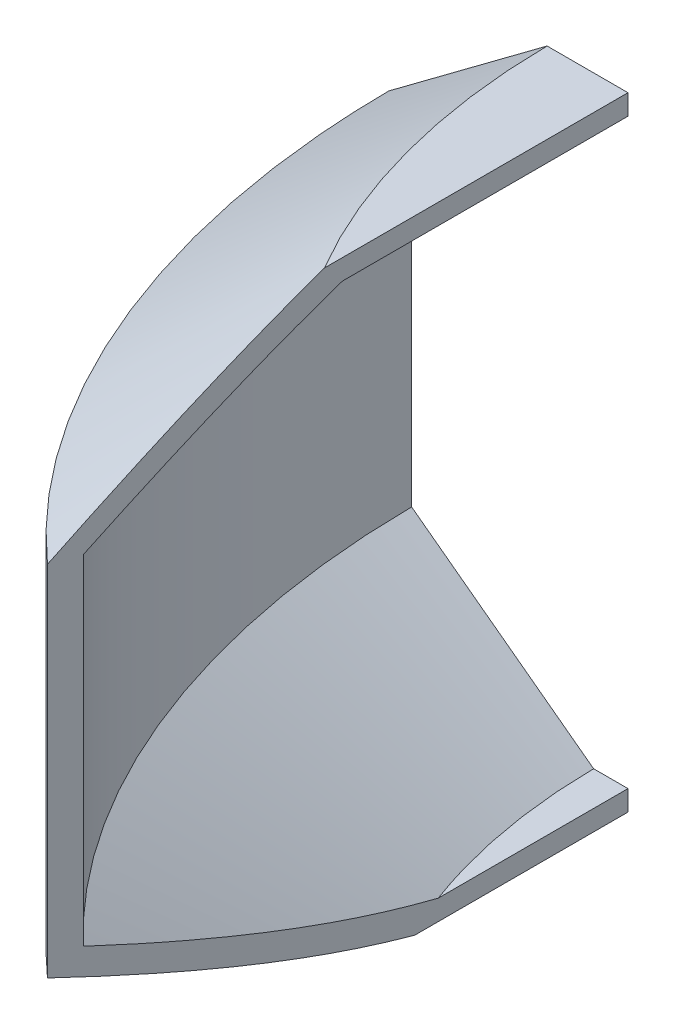
ISO-10303-21;
HEADER;
FILE_DESCRIPTION(('STEP AP214'),'2;1');
FILE_NAME('part.step','',(''),(''),'','','');
FILE_SCHEMA(('AUTOMOTIVE_DESIGN { 1 0 10303 214 1 1 1 1 }'));
ENDSEC;
DATA;
#1=APPLICATION_CONTEXT('core data for automotive mechanical design processes');
#2=APPLICATION_PROTOCOL_DEFINITION('international standard','automotive_design',2000,#1);
#3=PRODUCT_CONTEXT('',#1,'mechanical');
#4=PRODUCT('Part','Part','',(#3));
#5=PRODUCT_RELATED_PRODUCT_CATEGORY('part','',(#4));
#6=PRODUCT_DEFINITION_FORMATION('','',#4);
#7=PRODUCT_DEFINITION_CONTEXT('part definition',#1,'design');
#8=PRODUCT_DEFINITION('design','',#6,#7);
#9=PRODUCT_DEFINITION_SHAPE('','',#8);
#10=(LENGTH_UNIT() NAMED_UNIT(*) SI_UNIT(.MILLI.,.METRE.));
#11=(NAMED_UNIT(*) PLANE_ANGLE_UNIT() SI_UNIT($,.RADIAN.));
#12=(NAMED_UNIT(*) SI_UNIT($,.STERADIAN.) SOLID_ANGLE_UNIT());
#13=UNCERTAINTY_MEASURE_WITH_UNIT(LENGTH_MEASURE(1.E-05),#10,'distance_accuracy_value','');
#14=(GEOMETRIC_REPRESENTATION_CONTEXT(3) GLOBAL_UNCERTAINTY_ASSIGNED_CONTEXT((#13)) GLOBAL_UNIT_ASSIGNED_CONTEXT((#10,
#11,#12)) REPRESENTATION_CONTEXT('',''));
#15=CARTESIAN_POINT('',(0.,0.,0.));
#16=DIRECTION('',(0.,0.,1.));
#17=DIRECTION('',(1.,0.,0.));
#18=AXIS2_PLACEMENT_3D('',#15,#16,#17);
#19=CARTESIAN_POINT('',(0.,0.,150.));
#20=DIRECTION('',(0.,0.,1.));
#21=DIRECTION('',(1.,0.,0.));
#22=AXIS2_PLACEMENT_3D('',#19,#20,#21);
#23=PLANE('',#22);
#24=CARTESIAN_POINT('',(-325.505149333651,65.1189106132931,150.));
#25=CARTESIAN_POINT('',(-324.092485212729,66.1725488228257,150.));
#26=CARTESIAN_POINT('',(-322.67982050428,67.226186244635,150.));
#27=CARTESIAN_POINT('',(-319.854489464162,69.3334589119173,150.));
#28=CARTESIAN_POINT('',(-318.441823132493,70.3870941573903,150.));
#29=CARTESIAN_POINT('',(-314.203821030365,73.5479957280012,150.));
#30=CARTESIAN_POINT('',(-311.378482152828,75.6552578872993,150.));
#31=CARTESIAN_POINT('',(-308.553137339858,77.7625120885841,150.));
#32=B_SPLINE_CURVE_WITH_KNOTS('',3,(#24,#25,#26,#27,#28,#29,#30,#31),.UNSPECIFIED.,.F.,.F.,(4,2,
2,4),(0.,5.28696137267602,10.5739227453527,21.1478454908659),.UNSPECIFIED.);
#33=CARTESIAN_POINT('',(-325.505149333651,65.118910613293,150.));
#34=VERTEX_POINT('',#33);
#35=CARTESIAN_POINT('',(-308.553137339858,77.7625120885842,150.));
#36=VERTEX_POINT('',#35);
#37=EDGE_CURVE('E272',#34,#36,#32,.T.);
#38=ORIENTED_EDGE('',*,*,#37,.F.);
#39=DIRECTION('',(0.,1.,0.));
#40=VECTOR('',#39,1.);
#41=CARTESIAN_POINT('',(-325.505149333651,45.1189106132931,150.));
#42=LINE('',#41,#40);
#43=CARTESIAN_POINT('',(-325.505149333651,25.118910613293,150.));
#44=VERTEX_POINT('',#43);
#45=EDGE_CURVE('E224',#44,#34,#42,.T.);
#46=ORIENTED_EDGE('',*,*,#45,.F.);
#47=CARTESIAN_POINT('',(-304.052957277802,9.11891061329304,150.));
#48=CARTESIAN_POINT('',(-307.628340813314,11.7855528874402,150.));
#49=CARTESIAN_POINT('',(-311.20371239795,14.4522111849503,150.));
#50=CARTESIAN_POINT('',(-316.566758271069,18.4522140552676,150.));
#51=CARTESIAN_POINT('',(-318.354438311504,19.7855509160752,150.));
#52=CARTESIAN_POINT('',(-321.929795628149,22.4522283438555,150.));
#53=CARTESIAN_POINT('',(-323.717472904358,23.7855689108282,150.));
#54=CARTESIAN_POINT('',(-325.505149333651,25.1189106132931,150.));
#55=B_SPLINE_CURVE_WITH_KNOTS('',3,(#47,#48,#49,#50,#51,#52,#53,#54),.UNSPECIFIED.,.F.,.F.,(4,2,
2,4),(0.,13.3809243325822,20.0713864991394,26.7618486657284),.UNSPECIFIED.);
#56=CARTESIAN_POINT('',(-304.052957277802,9.11891061329304,150.));
#57=VERTEX_POINT('',#56);
#58=EDGE_CURVE('E218',#57,#44,#55,.T.);
#59=ORIENTED_EDGE('',*,*,#58,.F.);
#60=DIRECTION('',(-1.,0.,0.));
#61=VECTOR('',#60,1.);
#62=CARTESIAN_POINT('',(-304.054799780113,9.11891061329304,150.));
#63=LINE('',#62,#61);
#64=CARTESIAN_POINT('',(-300.,9.11891061329304,149.999999999977));
#65=VERTEX_POINT('',#64);
#66=EDGE_CURVE('E270',#65,#57,#63,.T.);
#67=ORIENTED_EDGE('',*,*,#66,.F.);
#68=DIRECTION('',(0.,-1.,0.));
#69=VECTOR('',#68,1.);
#70=CARTESIAN_POINT('',(-300.,0.,150.));
#71=LINE('',#70,#69);
#72=CARTESIAN_POINT('',(-300.,6.71891061329303,149.999999999977));
#73=VERTEX_POINT('',#72);
#74=EDGE_CURVE('E58',#65,#73,#71,.T.);
#75=ORIENTED_EDGE('',*,*,#74,.T.);
#76=DIRECTION('',(-1.,0.,0.));
#77=VECTOR('',#76,1.);
#78=CARTESIAN_POINT('',(-262.506364446809,6.71891061329304,150.));
#79=LINE('',#78,#77);
#80=CARTESIAN_POINT('',(-305.035719484775,6.71891061329304,150.));
#81=VERTEX_POINT('',#80);
#82=EDGE_CURVE('E51',#73,#81,#79,.T.);
#83=ORIENTED_EDGE('',*,*,#82,.T.);
#84=CARTESIAN_POINT('',(-305.035719484775,6.71891061329301,150.));
#85=CARTESIAN_POINT('',(-308.897318770376,9.59902831129325,150.));
#86=CARTESIAN_POINT('',(-312.758905264488,12.479163159687,150.));
#87=CARTESIAN_POINT('',(-318.551272862821,16.799381713052,150.));
#88=CARTESIAN_POINT('',(-320.482060038497,18.2394572776638,150.));
#89=CARTESIAN_POINT('',(-324.343631516274,21.1196122596548,150.));
#90=CARTESIAN_POINT('',(-326.274415818376,22.559691677034,150.));
#91=CARTESIAN_POINT('',(-328.205199270712,23.9997722337211,150.));
#92=B_SPLINE_CURVE_WITH_KNOTS('',3,(#84,#85,#86,#87,#88,#89,#90,#91),.UNSPECIFIED.,.F.,.F.,(4,2,
2,4),(0.,14.4521016799317,21.6781525201759,28.9042033604519),.UNSPECIFIED.);
#93=CARTESIAN_POINT('',(-328.205199270713,23.9997722337211,150.));
#94=VERTEX_POINT('',#93);
#95=EDGE_CURVE('E123',#81,#94,#92,.T.);
#96=ORIENTED_EDGE('',*,*,#95,.T.);
#97=DIRECTION('',(0.,1.,0.));
#98=VECTOR('',#97,1.);
#99=CARTESIAN_POINT('',(-328.205199270713,45.1189106132931,150.));
#100=LINE('',#99,#98);
#101=CARTESIAN_POINT('',(-328.205199270712,66.2380489928651,150.));
#102=VERTEX_POINT('',#101);
#103=EDGE_CURVE('E114',#94,#102,#100,.T.);
#104=ORIENTED_EDGE('',*,*,#103,.T.);
#105=CARTESIAN_POINT('',(-328.205199270713,66.2380489928651,150.));
#106=CARTESIAN_POINT('',(-326.64942750613,67.3984261000863,150.));
#107=CARTESIAN_POINT('',(-325.093655124156,68.5588023795449,150.));
#108=CARTESIAN_POINT('',(-321.982108601974,70.8795525811109,150.));
#109=CARTESIAN_POINT('',(-320.426334461767,72.0399265032183,150.));
#110=CARTESIAN_POINT('',(-315.759008618577,75.5210436808091,150.));
#111=CARTESIAN_POINT('',(-312.647453493072,77.8417823475263,150.));
#112=CARTESIAN_POINT('',(-309.53589171041,80.1625120885842,150.));
#113=B_SPLINE_CURVE_WITH_KNOTS('',3,(#105,#106,#107,#108,#109,#110,#111,#112),.UNSPECIFIED.,.F.,
.F.,(4,2,2,4),(0.,5.82255161677032,11.6451032335414,23.2902064672573),.UNSPECIFIED.);
#114=CARTESIAN_POINT('',(-309.53589171041,80.1625120885842,150.));
#115=VERTEX_POINT('',#114);
#116=EDGE_CURVE('E262',#102,#115,#113,.T.);
#117=ORIENTED_EDGE('',*,*,#116,.T.);
#118=DIRECTION('',(1.,0.,0.));
#119=VECTOR('',#118,1.);
#120=CARTESIAN_POINT('',(-262.506364446809,80.1625120885842,150.));
#121=LINE('',#120,#119);
#122=CARTESIAN_POINT('',(-300.,80.1625120885842,149.999999999977));
#123=VERTEX_POINT('',#122);
#124=EDGE_CURVE('E259',#115,#123,#121,.T.);
#125=ORIENTED_EDGE('',*,*,#124,.T.);
#126=CARTESIAN_POINT('',(-300.,77.7625120885841,149.999999999977));
#127=VERTEX_POINT('',#126);
#128=EDGE_CURVE('E38',#123,#127,#71,.T.);
#129=ORIENTED_EDGE('',*,*,#128,.T.);
#130=DIRECTION('',(1.,0.,0.));
#131=VECTOR('',#130,1.);
#132=CARTESIAN_POINT('',(-308.554799780113,77.7625120885841,150.));
#133=LINE('',#132,#131);
#134=EDGE_CURVE('E278',#36,#127,#133,.T.);
#135=ORIENTED_EDGE('',*,*,#134,.F.);
#136=EDGE_LOOP('',(#38,#46,#59,#67,#75,#83,#96,#104,#117,#125,#129,#135));
#137=FACE_BOUND('',#136,.T.);
#138=ADVANCED_FACE('F34',(#137),#23,.F.);
#139=CARTESIAN_POINT('',(-262.506364446809,25.1189106132931,230.000026632189));
#140=CARTESIAN_POINT('',(-136.506364446809,25.1189106132931,230.000026632189));
#141=CARTESIAN_POINT('',(-136.506364446809,25.1189106132931,69.0000266321888));
#142=CARTESIAN_POINT('',(-262.506364446809,25.1189106132931,69.0000266321888));
#143=CARTESIAN_POINT('',(-388.506364446809,25.1189106132931,69.0000266321888));
#144=CARTESIAN_POINT('',(-388.506364446809,25.1189106132931,230.000026632189));
#145=CARTESIAN_POINT('',(-262.506364446809,25.1189106132931,230.000026632189));
#146=CARTESIAN_POINT('',(-262.506364446809,9.11891061329303,202.589694002522));
#147=CARTESIAN_POINT('',(-179.409493780201,9.11891061329304,202.589694002522));
#148=CARTESIAN_POINT('',(-179.409493780201,9.11891061329303,96.410359261856));
#149=CARTESIAN_POINT('',(-262.506364446809,9.11891061329303,96.410359261856));
#150=CARTESIAN_POINT('',(-345.603235113417,9.11891061329302,96.410359261856));
#151=CARTESIAN_POINT('',(-345.603235113417,9.11891061329303,202.589694002522));
#152=CARTESIAN_POINT('',(-262.506364446809,9.11891061329303,202.589694002522));
#153=(BOUNDED_SURFACE() B_SPLINE_SURFACE(1,3,((#139,#140,#141,#142,#143,#144,#145),(#146,#147,
#148,#149,#150,#151,#152)),.UNSPECIFIED.,.F.,.T.,.F.) B_SPLINE_SURFACE_WITH_KNOTS((2,2),(4,3,4),
(0.,1.),(0.,0.5,1.),
.UNSPECIFIED.) GEOMETRIC_REPRESENTATION_ITEM() RATIONAL_B_SPLINE_SURFACE(((1.,0.333333333333333,
0.333333333333333,1.,0.333333333333333,0.333333333333333,1.),(1.,0.333333333333333,
0.333333333333333,1.,0.333333333333333,0.333333333333333,1.))) REPRESENTATION_ITEM('') SURFACE());
#154=CARTESIAN_POINT('',(-300.,9.11891061329303,172.375452770228));
#155=CARTESIAN_POINT('',(-300.,9.30008329530469,173.095757458267));
#156=CARTESIAN_POINT('',(-300.,9.48779693840823,173.814400042721));
#157=CARTESIAN_POINT('',(-300.,9.87538920342911,175.248280241861));
#158=CARTESIAN_POINT('',(-300.,10.0752659363197,175.963518366777));
#159=CARTESIAN_POINT('',(-300.,10.4863157554245,177.390702994637));
#160=CARTESIAN_POINT('',(-300.,10.6974883815921,178.102649630351));
#161=CARTESIAN_POINT('',(-300.,11.1301119663296,179.522715886379));
#162=CARTESIAN_POINT('',(-300.,11.3515535939503,180.230838352636));
#163=CARTESIAN_POINT('',(-300.,11.8041134629194,181.644010270722));
#164=CARTESIAN_POINT('',(-300.,12.035232066458,182.349059606436));
#165=CARTESIAN_POINT('',(-300.,12.506408040201,183.756169029804));
#166=CARTESIAN_POINT('',(-300.,12.7464655090062,184.458229084389));
#167=CARTESIAN_POINT('',(-300.,13.3566949315673,186.209123900045));
#168=CARTESIAN_POINT('',(-300.,13.7320136714519,187.256166859088));
#169=CARTESIAN_POINT('',(-300.,14.4990965425146,189.344180708625));
#170=CARTESIAN_POINT('',(-300.,14.8908604835406,190.385151669168));
#171=CARTESIAN_POINT('',(-300.,15.6891783898497,192.461938277392));
#172=CARTESIAN_POINT('',(-300.,16.0957389462092,193.497751388096));
#173=CARTESIAN_POINT('',(-300.,16.9218608293465,195.564181395965));
#174=CARTESIAN_POINT('',(-300.,17.341422246315,196.594798257023));
#175=CARTESIAN_POINT('',(-300.,18.1519404561861,198.554111744623));
#176=CARTESIAN_POINT('',(-300.,18.5418556370308,199.483239902606));
#177=CARTESIAN_POINT('',(-300.,19.3302494151967,201.337864368713));
#178=CARTESIAN_POINT('',(-300.,19.728728097909,202.263360640513));
#179=CARTESIAN_POINT('',(-300.,20.533423880845,204.111000521892));
#180=CARTESIAN_POINT('',(-300.,20.9396411238455,205.033144069239));
#181=CARTESIAN_POINT('',(-300.,21.7586768809875,206.873423545967));
#182=CARTESIAN_POINT('',(-300.,22.1714886234257,207.791562490963));
#183=CARTESIAN_POINT('',(-300.,23.0034334162562,209.624945312642));
#184=CARTESIAN_POINT('',(-300.,23.4225663267269,210.540189252866));
#185=CARTESIAN_POINT('',(-300.,24.2665698959102,212.367955154461));
#186=CARTESIAN_POINT('',(-300.,24.6914401741691,213.280477291466));
#187=CARTESIAN_POINT('',(-300.,25.1189106132931,214.191775252119));
#188=B_SPLINE_CURVE_WITH_KNOTS('',3,(#154,#155,#156,#157,#158,#159,#160,#161,#162,#163,#164,
#165,#166,#167,#168,#169,#170,#171,#172,#173,#174,#175,#176,#177,#178,#179,#180,#181,#182,#183,
#184,#185,#186,#187),.UNSPECIFIED.,.F.,.F.,(4,2,2,2,2,2,2,2,2,2,2,2,2,2,2,2,4),(0.,
2.2281647753546,4.4559843774384,6.6837133163347,8.90945623874294,11.1352825409638,
13.3611334026019,16.697801608261,20.0344312434159,23.3725658049997,26.7107235293668,
29.7335596845308,32.7564259959922,35.7793481336119,38.7993436580956,41.8192724316082,
44.839001922876),.UNSPECIFIED.);
#189=CARTESIAN_POINT('',(-300.,9.11891061329304,172.375452770228));
#190=VERTEX_POINT('',#189);
#191=CARTESIAN_POINT('',(-300.,25.118910613293,214.191775252119));
#192=VERTEX_POINT('',#191);
#193=EDGE_CURVE('E127',#190,#192,#188,.T.);
#194=CARTESIAN_POINT('',(-304.054799780113,9.11891061329304,149.500026632189));
#195=CARTESIAN_POINT('',(-304.054799780113,9.11891061329304,180.599233755854));
#196=CARTESIAN_POINT('',(-286.844874369677,9.11891061329304,202.589694002522));
#197=CARTESIAN_POINT('',(-262.506364446809,9.11891061329304,202.589694002522));
#198=(BOUNDED_CURVE() B_SPLINE_CURVE(3,(#194,#195,#196,#197),.UNSPECIFIED.,.F.,
.F.) B_SPLINE_CURVE_WITH_KNOTS((4,4),(0.,1.),
.UNSPECIFIED.) CURVE() GEOMETRIC_REPRESENTATION_ITEM() RATIONAL_B_SPLINE_CURVE((1.,
0.804737854124365,0.804737854124365,1.)) REPRESENTATION_ITEM(''));
#199=EDGE_CURVE('E153',#57,#190,#198,.T.);
#200=CARTESIAN_POINT('',(-325.506364446809,25.118910613293,149.500026632189));
#201=CARTESIAN_POINT('',(-325.506364446809,25.118910613293,196.655834861155));
#202=CARTESIAN_POINT('',(-299.410910017304,25.118910613293,230.000026632189));
#203=CARTESIAN_POINT('',(-262.506364446809,25.118910613293,230.000026632189));
#204=(BOUNDED_CURVE() B_SPLINE_CURVE(3,(#200,#201,#202,#203),.UNSPECIFIED.,.F.,
.F.) B_SPLINE_CURVE_WITH_KNOTS((4,4),(0.,1.),
.UNSPECIFIED.) CURVE() GEOMETRIC_REPRESENTATION_ITEM() RATIONAL_B_SPLINE_CURVE((1.,
0.804737854124365,0.804737854124365,1.)) REPRESENTATION_ITEM(''));
#205=EDGE_CURVE('E306',#44,#192,#204,.T.);
#206=ORIENTED_EDGE('',*,*,#193,.F.);
#207=ORIENTED_EDGE('',*,*,#199,.F.);
#208=ORIENTED_EDGE('',*,*,#58,.T.);
#209=ORIENTED_EDGE('',*,*,#205,.T.);
#210=EDGE_LOOP('',(#206,#207,#208,#209));
#211=FACE_BOUND('',#210,.T.);
#212=ADVANCED_FACE('F200',(#211),#153,.F.);
#213=CARTESIAN_POINT('',(-262.506364446809,9.11891061329304,230.000026632189));
#214=CARTESIAN_POINT('',(-136.506364446809,9.11891061329303,230.000026632189));
#215=CARTESIAN_POINT('',(-136.506364446809,9.11891061329303,69.0000266321889));
#216=CARTESIAN_POINT('',(-262.506364446809,9.11891061329303,69.0000266321888));
#217=CARTESIAN_POINT('',(-388.506364446809,9.11891061329303,69.0000266321888));
#218=CARTESIAN_POINT('',(-388.506364446809,9.11891061329303,230.000026632189));
#219=CARTESIAN_POINT('',(-262.506364446809,9.11891061329304,230.000026632189));
#220=(BOUNDED_CURVE() B_SPLINE_CURVE(3,(#213,#214,#215,#216,#217,#218,#219),.UNSPECIFIED.,.T.,
.F.) B_SPLINE_CURVE_WITH_KNOTS((4,3,4),(0.,0.5,1.),
.UNSPECIFIED.) CURVE() GEOMETRIC_REPRESENTATION_ITEM() RATIONAL_B_SPLINE_CURVE((1.,
0.333333333333333,0.333333333333333,1.,0.333333333333333,0.333333333333333,1.)) REPRESENTATION_ITEM(''));
#221=DIRECTION('',(0.,1.,0.));
#222=VECTOR('',#221,1.);
#223=SURFACE_OF_LINEAR_EXTRUSION('',#220,#222);
#224=DIRECTION('',(0.,1.,0.));
#225=VECTOR('',#224,1.);
#226=CARTESIAN_POINT('',(-300.,45.1189106132931,214.191775252119));
#227=LINE('',#226,#225);
#228=CARTESIAN_POINT('',(-300.,65.1189106132931,214.191775252119));
#229=VERTEX_POINT('',#228);
#230=EDGE_CURVE('E199',#192,#229,#227,.T.);
#231=ORIENTED_EDGE('',*,*,#230,.F.);
#232=ORIENTED_EDGE('',*,*,#205,.F.);
#233=ORIENTED_EDGE('',*,*,#45,.T.);
#234=CARTESIAN_POINT('',(-325.506364446809,65.1189106132931,149.500026632189));
#235=CARTESIAN_POINT('',(-325.506364446809,65.1189106132931,196.655834861155));
#236=CARTESIAN_POINT('',(-299.410910017304,65.1189106132931,230.000026632189));
#237=CARTESIAN_POINT('',(-262.506364446809,65.1189106132931,230.000026632189));
#238=(BOUNDED_CURVE() B_SPLINE_CURVE(3,(#234,#235,#236,#237),.UNSPECIFIED.,.F.,
.F.) B_SPLINE_CURVE_WITH_KNOTS((4,4),(0.,1.),
.UNSPECIFIED.) CURVE() GEOMETRIC_REPRESENTATION_ITEM() RATIONAL_B_SPLINE_CURVE((1.,
0.804737854124365,0.804737854124365,1.)) REPRESENTATION_ITEM(''));
#239=EDGE_CURVE('E300',#34,#229,#238,.T.);
#240=ORIENTED_EDGE('',*,*,#239,.T.);
#241=EDGE_LOOP('',(#231,#232,#233,#240));
#242=FACE_BOUND('',#241,.T.);
#243=ADVANCED_FACE('F207',(#242),#223,.F.);
#244=CARTESIAN_POINT('',(-308.554799780113,77.7625120885841,-149.499973367811));
#245=DIRECTION('',(0.,1.,0.));
#246=DIRECTION('',(-1.,0.,0.));
#247=AXIS2_PLACEMENT_3D('',#244,#245,#246);
#248=PLANE('',#247);
#249=DIRECTION('',(0.,0.,-1.));
#250=VECTOR('',#249,1.);
#251=CARTESIAN_POINT('',(-300.,77.7625120885841,-149.499973367811));
#252=LINE('',#251,#250);
#253=CARTESIAN_POINT('',(-300.,77.7625120885841,183.659634296149));
#254=VERTEX_POINT('',#253);
#255=EDGE_CURVE('E167',#254,#127,#252,.T.);
#256=ORIENTED_EDGE('',*,*,#255,.F.);
#257=CARTESIAN_POINT('',(-308.554799780113,77.7625120885841,149.500026632189));
#258=CARTESIAN_POINT('',(-308.554799780113,77.7625120885842,183.967505772208));
#259=CARTESIAN_POINT('',(-289.480913338998,77.7625120885842,208.339694002522));
#260=CARTESIAN_POINT('',(-262.506364446809,77.7625120885841,208.339694002522));
#261=(BOUNDED_CURVE() B_SPLINE_CURVE(3,(#257,#258,#259,#260),.UNSPECIFIED.,.F.,
.F.) B_SPLINE_CURVE_WITH_KNOTS((4,4),(0.,1.),
.UNSPECIFIED.) CURVE() GEOMETRIC_REPRESENTATION_ITEM() RATIONAL_B_SPLINE_CURVE((1.,
0.804737854124365,0.804737854124365,1.)) REPRESENTATION_ITEM(''));
#262=EDGE_CURVE('E298',#36,#254,#261,.T.);
#263=ORIENTED_EDGE('',*,*,#262,.F.);
#264=ORIENTED_EDGE('',*,*,#134,.T.);
#265=EDGE_LOOP('',(#256,#263,#264));
#266=FACE_BOUND('',#265,.T.);
#267=ADVANCED_FACE('F339',(#266),#248,.F.);
#268=CARTESIAN_POINT('',(-262.506364446809,65.1189106132931,69.0000266321888));
#269=CARTESIAN_POINT('',(-136.506364446809,65.1189106132931,69.0000266321889));
#270=CARTESIAN_POINT('',(-136.506364446809,65.1189106132931,230.000026632189));
#271=CARTESIAN_POINT('',(-262.506364446809,65.1189106132931,230.000026632189));
#272=CARTESIAN_POINT('',(-388.506364446809,65.1189106132931,230.000026632189));
#273=CARTESIAN_POINT('',(-388.506364446809,65.1189106132931,69.0000266321888));
#274=CARTESIAN_POINT('',(-262.506364446809,65.1189106132931,69.0000266321888));
#275=CARTESIAN_POINT('',(-262.506364446809,77.7625120885841,90.6603592618559));
#276=CARTESIAN_POINT('',(-170.409493780201,77.7625120885841,90.6603592618559));
#277=CARTESIAN_POINT('',(-170.409493780201,77.7625120885841,208.339694002522));
#278=CARTESIAN_POINT('',(-262.506364446809,77.7625120885841,208.339694002522));
#279=CARTESIAN_POINT('',(-354.603235113417,77.7625120885841,208.339694002522));
#280=CARTESIAN_POINT('',(-354.603235113417,77.7625120885841,90.6603592618559));
#281=CARTESIAN_POINT('',(-262.506364446809,77.7625120885841,90.6603592618559));
#282=(BOUNDED_SURFACE() B_SPLINE_SURFACE(1,3,((#268,#269,#270,#271,#272,#273,#274),(#275,#276,
#277,#278,#279,#280,#281)),.UNSPECIFIED.,.F.,.T.,.F.) B_SPLINE_SURFACE_WITH_KNOTS((2,2),(4,3,4),
(0.,1.),(0.,0.5,1.),
.UNSPECIFIED.) GEOMETRIC_REPRESENTATION_ITEM() RATIONAL_B_SPLINE_SURFACE(((1.,0.333333333333333,
0.333333333333333,1.,0.333333333333333,0.333333333333333,1.),(1.,0.333333333333333,
0.333333333333333,1.,0.333333333333333,0.333333333333333,1.))) REPRESENTATION_ITEM('') SURFACE());
#283=CARTESIAN_POINT('',(-300.,65.1189106132931,214.191775252119));
#284=CARTESIAN_POINT('',(-300.,65.4920197709864,213.39637970963));
#285=CARTESIAN_POINT('',(-300.,65.8631399345403,212.600051862519));
#286=CARTESIAN_POINT('',(-300.,66.6010446007859,211.005383529047));
#287=CARTESIAN_POINT('',(-300.,66.9678290731158,210.207043028639));
#288=CARTESIAN_POINT('',(-300.,68.0612811880412,207.808475756033));
#289=CARTESIAN_POINT('',(-300.,68.7808972024488,206.20502294502));
#290=CARTESIAN_POINT('',(-300.,70.2452357324347,202.880656073343));
#291=CARTESIAN_POINT('',(-300.,70.9884161657823,201.159061630169));
#292=CARTESIAN_POINT('',(-300.,72.4440550739135,197.703110451201));
#293=CARTESIAN_POINT('',(-300.,73.1565171663818,195.968755246554));
#294=CARTESIAN_POINT('',(-300.,74.1978174911854,193.354638134876));
#295=CARTESIAN_POINT('',(-300.,74.5406272948471,192.480432094693));
#296=CARTESIAN_POINT('',(-300.,75.2158928007389,190.728035691367));
#297=CARTESIAN_POINT('',(-300.,75.5483486263114,189.84984537583));
#298=CARTESIAN_POINT('',(-300.,76.2019153561108,188.088987386069));
#299=CARTESIAN_POINT('',(-300.,76.5230233025784,187.206318612123));
#300=CARTESIAN_POINT('',(-300.,77.152577805228,185.436437997816));
#301=CARTESIAN_POINT('',(-300.,77.4610238207002,184.549225965257));
#302=CARTESIAN_POINT('',(-300.,77.7625120885841,183.659634296149));
#303=B_SPLINE_CURVE_WITH_KNOTS('',3,(#283,#284,#285,#286,#287,#288,#289,#290,#291,#292,#293,
#294,#295,#296,#297,#298,#299,#300,#301,#302),.UNSPECIFIED.,.F.,.F.,(4,2,2,2,2,2,2,2,2,4),(0.,
2.63566940212468,5.27135725025529,10.5437928113635,16.1690273772319,21.7935976421419,
24.6105978512877,27.4275644899267,30.2452600193124,33.0630757494928),.UNSPECIFIED.);
#304=EDGE_CURVE('E159',#229,#254,#303,.T.);
#305=ORIENTED_EDGE('',*,*,#304,.F.);
#306=ORIENTED_EDGE('',*,*,#239,.F.);
#307=ORIENTED_EDGE('',*,*,#37,.T.);
#308=ORIENTED_EDGE('',*,*,#262,.T.);
#309=EDGE_LOOP('',(#305,#306,#307,#308));
#310=FACE_BOUND('',#309,.T.);
#311=ADVANCED_FACE('F169',(#310),#282,.F.);
#312=CARTESIAN_POINT('',(-304.054799780113,9.11891061329304,-149.499973367811));
#313=DIRECTION('',(0.,-1.,0.));
#314=DIRECTION('',(1.,0.,0.));
#315=AXIS2_PLACEMENT_3D('',#312,#313,#314);
#316=PLANE('',#315);
#317=DIRECTION('',(0.,0.,1.));
#318=VECTOR('',#317,1.);
#319=CARTESIAN_POINT('',(-300.,9.11891061329302,-149.499973367811));
#320=LINE('',#319,#318);
#321=EDGE_CURVE('E154',#65,#190,#320,.T.);
#322=ORIENTED_EDGE('',*,*,#321,.F.);
#323=ORIENTED_EDGE('',*,*,#66,.T.);
#324=ORIENTED_EDGE('',*,*,#199,.T.);
#325=EDGE_LOOP('',(#322,#323,#324));
#326=FACE_BOUND('',#325,.T.);
#327=ADVANCED_FACE('F180',(#326),#316,.F.);
#328=CARTESIAN_POINT('',(-300.,0.,0.));
#329=DIRECTION('',(1.,0.,0.));
#330=DIRECTION('',(0.,0.,-1.));
#331=AXIS2_PLACEMENT_3D('',#328,#329,#330);
#332=PLANE('',#331);
#333=ORIENTED_EDGE('',*,*,#304,.T.);
#334=ORIENTED_EDGE('',*,*,#255,.T.);
#335=ORIENTED_EDGE('',*,*,#128,.F.);
#336=DIRECTION('',(0.,0.,-1.));
#337=VECTOR('',#336,1.);
#338=CARTESIAN_POINT('',(-300.,80.1625120885842,-208.339640738144));
#339=LINE('',#338,#337);
#340=CARTESIAN_POINT('',(-300.,80.1625120885842,185.779844649267));
#341=VERTEX_POINT('',#340);
#342=EDGE_CURVE('E285',#341,#123,#339,.T.);
#343=ORIENTED_EDGE('',*,*,#342,.F.);
#344=CARTESIAN_POINT('',(-300.,66.2380489928651,218.437497136293));
#345=CARTESIAN_POINT('',(-300.,66.6562617902685,217.564995833541));
#346=CARTESIAN_POINT('',(-300.,67.0723868249286,216.691491330424));
#347=CARTESIAN_POINT('',(-300.,67.9000488887089,214.94230388943));
#348=CARTESIAN_POINT('',(-300.,68.3115858836759,214.066620935396));
#349=CARTESIAN_POINT('',(-300.,69.1297371504713,212.312737469043));
#350=CARTESIAN_POINT('',(-300.,69.5363503940402,211.434536476658));
#351=CARTESIAN_POINT('',(-300.,70.3440844243504,209.675614991897));
#352=CARTESIAN_POINT('',(-300.,70.7452052185456,208.79489450294));
#353=CARTESIAN_POINT('',(-300.,71.962281329015,206.098305261531));
#354=CARTESIAN_POINT('',(-300.,72.7685320059052,204.278039319295));
#355=CARTESIAN_POINT('',(-300.,74.3500567015645,200.624295226855));
#356=CARTESIAN_POINT('',(-300.,75.1253343039297,198.790818634271));
#357=CARTESIAN_POINT('',(-300.,76.2603831396003,196.027504773409));
#358=CARTESIAN_POINT('',(-300.,76.6343665072325,195.103497485707));
#359=CARTESIAN_POINT('',(-300.,77.3717494255017,193.251275851908));
#360=CARTESIAN_POINT('',(-300.,77.7351491024099,192.323061556156));
#361=CARTESIAN_POINT('',(-300.,78.4502947469105,190.461879094873));
#362=CARTESIAN_POINT('',(-300.,78.8020377669463,189.528909794749));
#363=CARTESIAN_POINT('',(-300.,79.4924348125786,187.658099089789));
#364=CARTESIAN_POINT('',(-300.,79.831088280624,186.720257479341));
#365=CARTESIAN_POINT('',(-300.,80.1625120885842,185.779844649267));
#366=B_SPLINE_CURVE_WITH_KNOTS('',3,(#344,#345,#346,#347,#348,#349,#350,#351,#352,#353,#354,
#355,#356,#357,#358,#359,#360,#361,#362,#363,#364,#365),.UNSPECIFIED.,.F.,.F.,(4,2,2,2,2,2,2,2,
2,2,4),(0.,2.9026619676032,5.80534552820501,8.70862516879245,11.611900868819,17.5841596492353,
23.555725424062,26.5461361639291,29.5365112113442,32.5276367370272,35.5188895300138),.UNSPECIFIED.);
#367=CARTESIAN_POINT('',(-300.000000000004,66.238048992865,218.43749713629));
#368=VERTEX_POINT('',#367);
#369=EDGE_CURVE('E279',#368,#341,#366,.T.);
#370=ORIENTED_EDGE('',*,*,#369,.F.);
#371=DIRECTION('',(0.,1.,0.));
#372=VECTOR('',#371,1.);
#373=CARTESIAN_POINT('',(-300.,45.1189106132931,218.437497136293));
#374=LINE('',#373,#372);
#375=CARTESIAN_POINT('',(-300.000000000004,23.9997722337211,218.43749713629));
#376=VERTEX_POINT('',#375);
#377=EDGE_CURVE('E297',#376,#368,#374,.T.);
#378=ORIENTED_EDGE('',*,*,#377,.F.);
#379=CARTESIAN_POINT('',(-300.000000000001,6.71891061329301,175.155260046619));
#380=CARTESIAN_POINT('',(-300.,6.93200761138484,175.9285440385));
#381=CARTESIAN_POINT('',(-300.,7.15204124180618,176.699896686725));
#382=CARTESIAN_POINT('',(-300.,7.6049053902041,178.238706209962));
#383=CARTESIAN_POINT('',(-300.,7.83773387203322,179.006163683733));
#384=CARTESIAN_POINT('',(-300.,8.31516983994549,180.53736371014));
#385=CARTESIAN_POINT('',(-300.,8.55977684232448,181.301106413914));
#386=CARTESIAN_POINT('',(-300.,9.05961879357936,182.824408728511));
#387=CARTESIAN_POINT('',(-300.,9.31484486803038,183.58397125461));
#388=CARTESIAN_POINT('',(-300.,9.83523465781838,185.099713282639));
#389=CARTESIAN_POINT('',(-300.,10.1003987541095,185.855892653636));
#390=CARTESIAN_POINT('',(-300.,10.6398421690341,187.364998056046));
#391=CARTESIAN_POINT('',(-300.,10.9141215927528,188.11792404984));
#392=CARTESIAN_POINT('',(-300.,11.6099971024237,189.995630794078));
#393=CARTESIAN_POINT('',(-300.,12.0368062063009,191.118481300018));
#394=CARTESIAN_POINT('',(-300.,12.9069493747356,193.357776498337));
#395=CARTESIAN_POINT('',(-300.,13.3502838537816,194.47422102923));
#396=CARTESIAN_POINT('',(-300.,14.2516823924847,196.701645666763));
#397=CARTESIAN_POINT('',(-300.,14.7097521131649,197.812623479548));
#398=CARTESIAN_POINT('',(-300.,15.6387433640846,200.029170799135));
#399=CARTESIAN_POINT('',(-300.,16.109664743155,201.134740369373));
#400=CARTESIAN_POINT('',(-300.,16.9790165825477,203.146839552909));
#401=CARTESIAN_POINT('',(-300.,17.3756208449334,204.05415949946));
#402=CARTESIAN_POINT('',(-300.,18.1758347524512,205.865708729537));
#403=CARTESIAN_POINT('',(-300.,18.5794444301381,206.769937998677));
#404=CARTESIAN_POINT('',(-300.,19.3930243324691,208.575541099616));
#405=CARTESIAN_POINT('',(-300.,19.8029946299323,209.476914898583));
#406=CARTESIAN_POINT('',(-300.,20.6283844981106,211.276285144371));
#407=CARTESIAN_POINT('',(-300.,21.0437994192549,212.174283724977));
#408=CARTESIAN_POINT('',(-300.,21.8798809188248,213.96781610795));
#409=CARTESIAN_POINT('',(-300.,22.3005474242716,214.863349944358));
#410=CARTESIAN_POINT('',(-300.,23.1466729319373,216.65210443924));
#411=CARTESIAN_POINT('',(-300.,23.572131728984,217.545325194747));
#412=CARTESIAN_POINT('',(-300.,23.9997722337211,218.437497136293));
#413=B_SPLINE_CURVE_WITH_KNOTS('',3,(#379,#380,#381,#382,#383,#384,#385,#386,#387,#388,#389,
#390,#391,#392,#393,#394,#395,#396,#397,#398,#399,#400,#401,#402,#403,#404,#405,#406,#407,#408,
#409,#410,#411,#412),.UNSPECIFIED.,.F.,.F.,(4,2,2,2,2,2,2,2,2,2,2,2,2,2,2,2,4),(0.,
2.40626615593547,4.81215048610795,7.21793609883847,9.62175005039802,12.0256562417818,
14.4295901560074,18.033127896102,21.6367560808203,25.2417856515054,28.8467728358593,
31.8173851374463,34.7880112474082,37.7586713914664,40.7269414987433,43.6951704031984,
46.6632727084147),.UNSPECIFIED.);
#414=CARTESIAN_POINT('',(-300.,6.71891061329303,175.155260046621));
#415=VERTEX_POINT('',#414);
#416=EDGE_CURVE('E131',#415,#376,#413,.T.);
#417=ORIENTED_EDGE('',*,*,#416,.F.);
#418=DIRECTION('',(0.,0.,1.));
#419=VECTOR('',#418,1.);
#420=CARTESIAN_POINT('',(-300.,6.71891061329303,-202.589640738144));
#421=LINE('',#420,#419);
#422=EDGE_CURVE('E269',#73,#415,#421,.T.);
#423=ORIENTED_EDGE('',*,*,#422,.F.);
#424=ORIENTED_EDGE('',*,*,#74,.F.);
#425=ORIENTED_EDGE('',*,*,#321,.T.);
#426=ORIENTED_EDGE('',*,*,#193,.T.);
#427=ORIENTED_EDGE('',*,*,#230,.T.);
#428=EDGE_LOOP('',(#333,#334,#335,#343,#370,#378,#417,#423,#424,#425,#426,#427));
#429=FACE_BOUND('',#428,.T.);
#430=ADVANCED_FACE('F175',(#429),#332,.T.);
#431=CARTESIAN_POINT('',(-262.506364446809,6.71891061329304,-202.589640738144));
#432=DIRECTION('',(0.,-1.,0.));
#433=DIRECTION('',(0.,0.,-1.));
#434=AXIS2_PLACEMENT_3D('',#431,#432,#433);
#435=PLANE('',#434);
#436=ORIENTED_EDGE('',*,*,#82,.F.);
#437=ORIENTED_EDGE('',*,*,#422,.T.);
#438=CARTESIAN_POINT('',(-262.506364446809,6.71891061329304,203.84539131074));
#439=CARTESIAN_POINT('',(-287.420538202396,6.71891061329304,203.84539131074));
#440=CARTESIAN_POINT('',(-305.037519412632,6.71891061329304,181.334804208772));
#441=CARTESIAN_POINT('',(-305.037519412632,6.71891061329304,149.500026632189));
#442=(BOUNDED_CURVE() B_SPLINE_CURVE(3,(#438,#439,#440,#441),.UNSPECIFIED.,.F.,
.F.) B_SPLINE_CURVE_WITH_KNOTS((4,4),(0.,1.),
.UNSPECIFIED.) CURVE() GEOMETRIC_REPRESENTATION_ITEM() RATIONAL_B_SPLINE_CURVE((1.,
0.804737854124365,0.804737854124365,1.)) REPRESENTATION_ITEM(''));
#443=EDGE_CURVE('E11',#81,#415,#442,.F.);
#444=ORIENTED_EDGE('',*,*,#443,.F.);
#445=EDGE_LOOP('',(#436,#437,#444));
#446=FACE_BOUND('',#445,.T.);
#447=ADVANCED_FACE('F179',(#446),#435,.T.);
#448=CARTESIAN_POINT('',(-262.506364446809,66.2380489928651,65.5500266321889));
#449=CARTESIAN_POINT('',(-131.106364446809,66.2380489928651,65.5500266321889));
#450=CARTESIAN_POINT('',(-131.106364446809,66.2380489928651,233.450026632189));
#451=CARTESIAN_POINT('',(-262.506364446809,66.2380489928651,233.450026632189));
#452=CARTESIAN_POINT('',(-393.906364446809,66.2380489928651,233.450026632189));
#453=CARTESIAN_POINT('',(-393.906364446809,66.2380489928651,65.5500266321888));
#454=CARTESIAN_POINT('',(-262.506364446809,66.2380489928651,65.5500266321888));
#455=CARTESIAN_POINT('',(-262.506364446809,80.1625120885842,89.4046619536376));
#456=CARTESIAN_POINT('',(-168.444054515164,80.1625120885842,89.4046619536377));
#457=CARTESIAN_POINT('',(-168.444054515164,80.1625120885842,209.59539131074));
#458=CARTESIAN_POINT('',(-262.506364446809,80.1625120885842,209.59539131074));
#459=CARTESIAN_POINT('',(-356.568674378455,80.1625120885842,209.59539131074));
#460=CARTESIAN_POINT('',(-356.568674378455,80.1625120885842,89.4046619536377));
#461=CARTESIAN_POINT('',(-262.506364446809,80.1625120885842,89.4046619536376));
#462=(BOUNDED_SURFACE() B_SPLINE_SURFACE(1,3,((#448,#449,#450,#451,#452,#453,#454),(#455,#456,
#457,#458,#459,#460,#461)),.UNSPECIFIED.,.F.,.T.,.F.) B_SPLINE_SURFACE_WITH_KNOTS((2,2),(4,3,4),
(0.,1.),(0.,0.5,1.),
.UNSPECIFIED.) GEOMETRIC_REPRESENTATION_ITEM() RATIONAL_B_SPLINE_SURFACE(((1.,0.333333333333333,
0.333333333333333,1.,0.333333333333333,0.333333333333333,1.),(1.,0.333333333333333,
0.333333333333333,1.,0.333333333333333,0.333333333333333,1.))) REPRESENTATION_ITEM('') SURFACE());
#463=CARTESIAN_POINT('',(-262.506364446809,66.2380489928651,233.450026632189));
#464=CARTESIAN_POINT('',(-300.992533398897,66.2380489928651,233.450026632189));
#465=CARTESIAN_POINT('',(-328.206364446809,66.2380489928651,198.676798070968));
#466=CARTESIAN_POINT('',(-328.206364446809,66.2380489928651,149.500026632189));
#467=(BOUNDED_CURVE() B_SPLINE_CURVE(3,(#463,#464,#465,#466),.UNSPECIFIED.,.F.,
.F.) B_SPLINE_CURVE_WITH_KNOTS((4,4),(0.,1.),
.UNSPECIFIED.) CURVE() GEOMETRIC_REPRESENTATION_ITEM() RATIONAL_B_SPLINE_CURVE((1.,
0.804737854124365,0.804737854124365,1.)) REPRESENTATION_ITEM(''));
#468=EDGE_CURVE('E120',#102,#368,#467,.F.);
#469=CARTESIAN_POINT('',(-309.537519412632,80.1625120885842,149.500026632189));
#470=CARTESIAN_POINT('',(-309.537519412632,80.1625120885842,183.620889909717));
#471=CARTESIAN_POINT('',(-291.02830416045,80.1625120885842,208.215186124812));
#472=CARTESIAN_POINT('',(-264.345443359509,80.1625120885842,209.549428504834));
#473=(BOUNDED_CURVE() B_SPLINE_CURVE(3,(#469,#470,#471,#472),.UNSPECIFIED.,.F.,
.F.) B_SPLINE_CURVE_WITH_KNOTS((4,4),(0.,1.),
.UNSPECIFIED.) CURVE() GEOMETRIC_REPRESENTATION_ITEM() RATIONAL_B_SPLINE_CURVE((1.,
0.813866236131488,0.813866236131488,1.)) REPRESENTATION_ITEM(''));
#474=EDGE_CURVE('E134',#115,#341,#473,.T.);
#475=ORIENTED_EDGE('',*,*,#468,.T.);
#476=ORIENTED_EDGE('',*,*,#369,.T.);
#477=ORIENTED_EDGE('',*,*,#474,.F.);
#478=ORIENTED_EDGE('',*,*,#116,.F.);
#479=EDGE_LOOP('',(#475,#476,#477,#478));
#480=FACE_BOUND('',#479,.T.);
#481=ADVANCED_FACE('F243',(#480),#462,.T.);
#482=CARTESIAN_POINT('',(-262.506364446809,23.9997722337211,233.450026632189));
#483=CARTESIAN_POINT('',(-131.106364446809,23.9997722337211,233.450026632189));
#484=CARTESIAN_POINT('',(-131.106364446809,23.9997722337211,65.5500266321889));
#485=CARTESIAN_POINT('',(-262.506364446809,23.9997722337211,65.5500266321888));
#486=CARTESIAN_POINT('',(-393.906364446809,23.9997722337211,65.5500266321888));
#487=CARTESIAN_POINT('',(-393.906364446809,23.9997722337211,233.450026632189));
#488=CARTESIAN_POINT('',(-262.506364446809,23.9997722337211,233.450026632189));
#489=CARTESIAN_POINT('',(-262.506364446809,6.71891061329301,203.84539131074));
#490=CARTESIAN_POINT('',(-177.444054515164,6.718910613293,203.84539131074));
#491=CARTESIAN_POINT('',(-177.444054515164,6.718910613293,95.1546619536376));
#492=CARTESIAN_POINT('',(-262.506364446809,6.718910613293,95.1546619536376));
#493=CARTESIAN_POINT('',(-347.568674378455,6.718910613293,95.1546619536376));
#494=CARTESIAN_POINT('',(-347.568674378455,6.718910613293,203.84539131074));
#495=CARTESIAN_POINT('',(-262.506364446809,6.71891061329301,203.84539131074));
#496=(BOUNDED_SURFACE() B_SPLINE_SURFACE(1,3,((#482,#483,#484,#485,#486,#487,#488),(#489,#490,
#491,#492,#493,#494,#495)),.UNSPECIFIED.,.F.,.T.,.F.) B_SPLINE_SURFACE_WITH_KNOTS((2,2),(4,3,4),
(0.,1.),(0.,0.5,1.),
.UNSPECIFIED.) GEOMETRIC_REPRESENTATION_ITEM() RATIONAL_B_SPLINE_SURFACE(((1.,0.333333333333333,
0.333333333333333,1.,0.333333333333333,0.333333333333333,1.),(1.,0.333333333333333,
0.333333333333333,1.,0.333333333333333,0.333333333333333,1.))) REPRESENTATION_ITEM('') SURFACE());
#497=CARTESIAN_POINT('',(-328.206364446809,23.9997722337211,149.500026632189));
#498=CARTESIAN_POINT('',(-328.206364446809,23.9997722337211,198.676798070968));
#499=CARTESIAN_POINT('',(-300.992533398897,23.9997722337211,233.450026632189));
#500=CARTESIAN_POINT('',(-262.506364446809,23.9997722337211,233.450026632189));
#501=(BOUNDED_CURVE() B_SPLINE_CURVE(3,(#497,#498,#499,#500),.UNSPECIFIED.,.F.,
.F.) B_SPLINE_CURVE_WITH_KNOTS((4,4),(0.,1.),
.UNSPECIFIED.) CURVE() GEOMETRIC_REPRESENTATION_ITEM() RATIONAL_B_SPLINE_CURVE((1.,
0.804737854124365,0.804737854124365,1.)) REPRESENTATION_ITEM(''));
#502=EDGE_CURVE('E43',#94,#376,#501,.T.);
#503=ORIENTED_EDGE('',*,*,#443,.T.);
#504=ORIENTED_EDGE('',*,*,#416,.T.);
#505=ORIENTED_EDGE('',*,*,#502,.F.);
#506=ORIENTED_EDGE('',*,*,#95,.F.);
#507=EDGE_LOOP('',(#503,#504,#505,#506));
#508=FACE_BOUND('',#507,.T.);
#509=ADVANCED_FACE('F129',(#508),#496,.T.);
#510=CARTESIAN_POINT('',(-262.506364446809,9.11891061329304,233.450026632189));
#511=CARTESIAN_POINT('',(-131.106364446809,9.11891061329302,233.450026632189));
#512=CARTESIAN_POINT('',(-131.106364446809,9.11891061329303,65.5500266321889));
#513=CARTESIAN_POINT('',(-262.506364446809,9.11891061329304,65.5500266321888));
#514=CARTESIAN_POINT('',(-393.906364446809,9.11891061329303,65.5500266321888));
#515=CARTESIAN_POINT('',(-393.906364446809,9.11891061329303,233.450026632189));
#516=CARTESIAN_POINT('',(-262.506364446809,9.11891061329304,233.450026632189));
#517=(BOUNDED_CURVE() B_SPLINE_CURVE(3,(#510,#511,#512,#513,#514,#515,#516),.UNSPECIFIED.,.T.,
.F.) B_SPLINE_CURVE_WITH_KNOTS((4,3,4),(0.,0.5,1.),
.UNSPECIFIED.) CURVE() GEOMETRIC_REPRESENTATION_ITEM() RATIONAL_B_SPLINE_CURVE((1.,
0.333333333333333,0.333333333333333,1.,0.333333333333333,0.333333333333333,1.)) REPRESENTATION_ITEM(''));
#518=DIRECTION('',(0.,1.,0.));
#519=VECTOR('',#518,1.);
#520=SURFACE_OF_LINEAR_EXTRUSION('',#517,#519);
#521=ORIENTED_EDGE('',*,*,#502,.T.);
#522=ORIENTED_EDGE('',*,*,#377,.T.);
#523=ORIENTED_EDGE('',*,*,#468,.F.);
#524=ORIENTED_EDGE('',*,*,#103,.F.);
#525=EDGE_LOOP('',(#521,#522,#523,#524));
#526=FACE_BOUND('',#525,.T.);
#527=ADVANCED_FACE('F116',(#526),#520,.T.);
#528=CARTESIAN_POINT('',(-262.506364446809,80.1625120885842,-208.339640738144));
#529=DIRECTION('',(0.,1.,0.));
#530=DIRECTION('',(0.,0.,1.));
#531=AXIS2_PLACEMENT_3D('',#528,#529,#530);
#532=PLANE('',#531);
#533=ORIENTED_EDGE('',*,*,#474,.T.);
#534=ORIENTED_EDGE('',*,*,#342,.T.);
#535=ORIENTED_EDGE('',*,*,#124,.F.);
#536=EDGE_LOOP('',(#533,#534,#535));
#537=FACE_BOUND('',#536,.T.);
#538=ADVANCED_FACE('F36',(#537),#532,.T.);
#539=CLOSED_SHELL('',(#138,#212,#243,#267,#311,#327,#430,#447,#481,#509,#527,#538));
#540=MANIFOLD_SOLID_BREP('B2',#539);
#541=ADVANCED_BREP_SHAPE_REPRESENTATION('',(#18,#540),#14);
#542=SHAPE_DEFINITION_REPRESENTATION(#9,#541);
ENDSEC;
END-ISO-10303-21;
